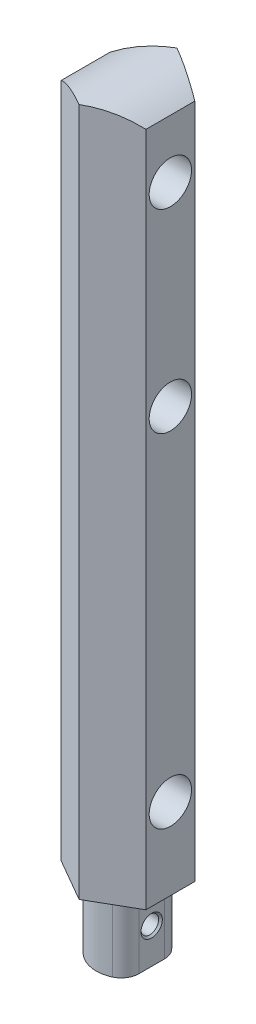
ISO-10303-21;
HEADER;
FILE_DESCRIPTION(('STEP AP214'),'2;1');
FILE_NAME('part.step','',(''),(''),'','','');
FILE_SCHEMA(('AUTOMOTIVE_DESIGN { 1 0 10303 214 1 1 1 1 }'));
ENDSEC;
DATA;
#1=APPLICATION_CONTEXT('core data for automotive mechanical design processes');
#2=APPLICATION_PROTOCOL_DEFINITION('international standard','automotive_design',2000,#1);
#3=PRODUCT_CONTEXT('',#1,'mechanical');
#4=PRODUCT('Part','Part','',(#3));
#5=PRODUCT_RELATED_PRODUCT_CATEGORY('part','',(#4));
#6=PRODUCT_DEFINITION_FORMATION('','',#4);
#7=PRODUCT_DEFINITION_CONTEXT('part definition',#1,'design');
#8=PRODUCT_DEFINITION('design','',#6,#7);
#9=PRODUCT_DEFINITION_SHAPE('','',#8);
#10=(LENGTH_UNIT() NAMED_UNIT(*) SI_UNIT(.MILLI.,.METRE.));
#11=(NAMED_UNIT(*) PLANE_ANGLE_UNIT() SI_UNIT($,.RADIAN.));
#12=(NAMED_UNIT(*) SI_UNIT($,.STERADIAN.) SOLID_ANGLE_UNIT());
#13=UNCERTAINTY_MEASURE_WITH_UNIT(LENGTH_MEASURE(1.E-05),#10,'distance_accuracy_value','');
#14=(GEOMETRIC_REPRESENTATION_CONTEXT(3) GLOBAL_UNCERTAINTY_ASSIGNED_CONTEXT((#13)) GLOBAL_UNIT_ASSIGNED_CONTEXT((#10,
#11,#12)) REPRESENTATION_CONTEXT('',''));
#15=CARTESIAN_POINT('',(0.,0.,0.));
#16=DIRECTION('',(0.,0.,1.));
#17=DIRECTION('',(1.,0.,0.));
#18=AXIS2_PLACEMENT_3D('',#15,#16,#17);
#19=CARTESIAN_POINT('',(11.9999999999999,-195.,-6.92820323027564));
#20=DIRECTION('',(0.499999999999995,0.,-0.866025403784441));
#21=DIRECTION('',(-0.866025403784441,0.,-0.499999999999995));
#22=AXIS2_PLACEMENT_3D('',#19,#20,#21);
#23=PLANE('',#22);
#24=CARTESIAN_POINT('',(0.,-22.,-13.856406460551));
#25=DIRECTION('',(0.499999999999995,0.,-0.866025403784441));
#26=DIRECTION('',(-0.866025403784441,0.,-0.499999999999995));
#27=AXIS2_PLACEMENT_3D('',#24,#25,#26);
#28=ELLIPSE('',#27,25.4034118443434,22.);
#29=CARTESIAN_POINT('',(11.9999999999999,-3.56091108541416,-6.92820323027564));
#30=VERTEX_POINT('',#29);
#31=CARTESIAN_POINT('',(0.,0.,-13.856406460551));
#32=VERTEX_POINT('',#31);
#33=EDGE_CURVE('E173',#30,#32,#28,.F.);
#34=ORIENTED_EDGE('',*,*,#33,.F.);
#35=DIRECTION('',(0.,1.,0.));
#36=VECTOR('',#35,1.);
#37=CARTESIAN_POINT('',(11.9999999999999,-195.,-6.92820323027564));
#38=LINE('',#37,#36);
#39=CARTESIAN_POINT('',(11.9999999999999,-195.,-6.92820323027564));
#40=VERTEX_POINT('',#39);
#41=EDGE_CURVE('E11',#40,#30,#38,.T.);
#42=ORIENTED_EDGE('',*,*,#41,.F.);
#43=DIRECTION('',(-0.866025403784441,0.,-0.499999999999995));
#44=VECTOR('',#43,1.);
#45=CARTESIAN_POINT('',(11.9999999999999,-195.,-6.92820323027564));
#46=LINE('',#45,#44);
#47=CARTESIAN_POINT('',(0.,-195.,-13.856406460551));
#48=VERTEX_POINT('',#47);
#49=EDGE_CURVE('E203',#40,#48,#46,.T.);
#50=ORIENTED_EDGE('',*,*,#49,.T.);
#51=DIRECTION('',(0.,1.,0.));
#52=VECTOR('',#51,1.);
#53=CARTESIAN_POINT('',(0.,-195.,-13.856406460551));
#54=LINE('',#53,#52);
#55=EDGE_CURVE('E145',#48,#32,#54,.T.);
#56=ORIENTED_EDGE('',*,*,#55,.T.);
#57=EDGE_LOOP('',(#34,#42,#50,#56));
#58=FACE_BOUND('',#57,.T.);
#59=ADVANCED_FACE('F37',(#58),#23,.T.);
#60=CARTESIAN_POINT('',(12.,-195.,6.92820323027539));
#61=DIRECTION('',(1.,0.,0.));
#62=DIRECTION('',(0.,0.,-1.));
#63=AXIS2_PLACEMENT_3D('',#60,#61,#62);
#64=PLANE('',#63);
#65=CARTESIAN_POINT('',(12.,-75.,-1.26194426293921E-13));
#66=DIRECTION('',(1.,0.,0.));
#67=DIRECTION('',(0.,0.,-1.));
#68=AXIS2_PLACEMENT_3D('',#65,#66,#67);
#69=CIRCLE('',#68,6.00000000000001);
#70=CARTESIAN_POINT('',(11.9999999999999,-75.,-6.00000000000013));
#71=VERTEX_POINT('',#70);
#72=EDGE_CURVE('E497',#71,#71,#69,.T.);
#73=ORIENTED_EDGE('',*,*,#72,.F.);
#74=EDGE_LOOP('',(#73));
#75=FACE_BOUND('',#74,.T.);
#76=CARTESIAN_POINT('',(12.,-20.,-1.26194426293921E-13));
#77=DIRECTION('',(1.,0.,0.));
#78=DIRECTION('',(0.,0.,-1.));
#79=AXIS2_PLACEMENT_3D('',#76,#77,#78);
#80=CIRCLE('',#79,6.00000000000001);
#81=CARTESIAN_POINT('',(11.9999999999999,-20.,-6.00000000000014));
#82=VERTEX_POINT('',#81);
#83=EDGE_CURVE('E485',#82,#82,#80,.T.);
#84=ORIENTED_EDGE('',*,*,#83,.F.);
#85=EDGE_LOOP('',(#84));
#86=FACE_BOUND('',#85,.T.);
#87=CARTESIAN_POINT('',(12.,-172.,-1.26194426293921E-13));
#88=DIRECTION('',(1.,0.,0.));
#89=DIRECTION('',(0.,0.,-1.));
#90=AXIS2_PLACEMENT_3D('',#87,#88,#89);
#91=CIRCLE('',#90,6.00000000000001);
#92=CARTESIAN_POINT('',(11.9999999999999,-172.,-6.00000000000013));
#93=VERTEX_POINT('',#92);
#94=EDGE_CURVE('E473',#93,#93,#91,.T.);
#95=ORIENTED_EDGE('',*,*,#94,.F.);
#96=EDGE_LOOP('',(#95));
#97=FACE_BOUND('',#96,.T.);
#98=ORIENTED_EDGE('',*,*,#41,.T.);
#99=DIRECTION('',(0.,0.,-1.));
#100=VECTOR('',#99,1.);
#101=CARTESIAN_POINT('',(11.9999999999999,-3.56091108541416,20.));
#102=LINE('',#101,#100);
#103=CARTESIAN_POINT('',(11.9999999999999,-3.56091108541416,6.92820323027547));
#104=VERTEX_POINT('',#103);
#105=EDGE_CURVE('E127',#104,#30,#102,.T.);
#106=ORIENTED_EDGE('',*,*,#105,.F.);
#107=DIRECTION('',(0.,1.,0.));
#108=VECTOR('',#107,1.);
#109=CARTESIAN_POINT('',(12.,-195.,6.92820323027539));
#110=LINE('',#109,#108);
#111=CARTESIAN_POINT('',(12.,-195.,6.92820323027539));
#112=VERTEX_POINT('',#111);
#113=EDGE_CURVE('E50',#112,#104,#110,.T.);
#114=ORIENTED_EDGE('',*,*,#113,.F.);
#115=DIRECTION('',(0.,0.,-1.));
#116=VECTOR('',#115,1.);
#117=CARTESIAN_POINT('',(12.,-195.,6.92820323027539));
#118=LINE('',#117,#116);
#119=EDGE_CURVE('E149',#112,#40,#118,.T.);
#120=ORIENTED_EDGE('',*,*,#119,.T.);
#121=EDGE_LOOP('',(#98,#106,#114,#120));
#122=FACE_BOUND('',#121,.T.);
#123=ADVANCED_FACE('F167',(#75,#86,#97,#122),#64,.T.);
#124=CARTESIAN_POINT('',(0.,-195.,13.856406460551));
#125=DIRECTION('',(0.500000000000007,0.,0.866025403784434));
#126=DIRECTION('',(0.866025403784435,0.,-0.500000000000007));
#127=AXIS2_PLACEMENT_3D('',#124,#125,#126);
#128=PLANE('',#127);
#129=CARTESIAN_POINT('',(0.,-22.,13.8564064605511));
#130=DIRECTION('',(0.500000000000007,0.,0.866025403784434));
#131=DIRECTION('',(0.866025403784435,0.,-0.500000000000007));
#132=AXIS2_PLACEMENT_3D('',#129,#130,#131);
#133=ELLIPSE('',#132,25.4034118443437,22.);
#134=CARTESIAN_POINT('',(0.,0.,13.8564064605511));
#135=VERTEX_POINT('',#134);
#136=EDGE_CURVE('E136',#135,#104,#133,.F.);
#137=ORIENTED_EDGE('',*,*,#136,.F.);
#138=DIRECTION('',(0.,1.,0.));
#139=VECTOR('',#138,1.);
#140=CARTESIAN_POINT('',(0.,-195.,13.856406460551));
#141=LINE('',#140,#139);
#142=CARTESIAN_POINT('',(0.,-195.,13.856406460551));
#143=VERTEX_POINT('',#142);
#144=EDGE_CURVE('E135',#143,#135,#141,.T.);
#145=ORIENTED_EDGE('',*,*,#144,.F.);
#146=DIRECTION('',(0.866025403784434,0.,-0.500000000000007));
#147=VECTOR('',#146,1.);
#148=CARTESIAN_POINT('',(0.,-195.,13.856406460551));
#149=LINE('',#148,#147);
#150=EDGE_CURVE('E154',#143,#112,#149,.T.);
#151=ORIENTED_EDGE('',*,*,#150,.T.);
#152=ORIENTED_EDGE('',*,*,#113,.T.);
#153=EDGE_LOOP('',(#137,#145,#151,#152));
#154=FACE_BOUND('',#153,.T.);
#155=ADVANCED_FACE('F164',(#154),#128,.T.);
#156=CARTESIAN_POINT('',(-12.,-195.,6.92820323027556));
#157=DIRECTION('',(-0.499999999999995,0.,0.866025403784441));
#158=DIRECTION('',(0.866025403784442,0.,0.499999999999995));
#159=AXIS2_PLACEMENT_3D('',#156,#157,#158);
#160=PLANE('',#159);
#161=CARTESIAN_POINT('',(0.,-22.,13.8564064605509));
#162=DIRECTION('',(-0.499999999999995,0.,0.866025403784441));
#163=DIRECTION('',(-0.866025403784442,0.,-0.499999999999995));
#164=AXIS2_PLACEMENT_3D('',#161,#162,#163);
#165=ELLIPSE('',#164,25.4034118443434,22.);
#166=CARTESIAN_POINT('',(-12.,-3.56091108541423,6.92820323027556));
#167=VERTEX_POINT('',#166);
#168=EDGE_CURVE('E120',#167,#135,#165,.F.);
#169=ORIENTED_EDGE('',*,*,#168,.F.);
#170=DIRECTION('',(0.,1.,0.));
#171=VECTOR('',#170,1.);
#172=CARTESIAN_POINT('',(-12.,-195.,6.92820323027556));
#173=LINE('',#172,#171);
#174=CARTESIAN_POINT('',(-12.,-195.,6.92820323027556));
#175=VERTEX_POINT('',#174);
#176=EDGE_CURVE('E133',#175,#167,#173,.T.);
#177=ORIENTED_EDGE('',*,*,#176,.F.);
#178=DIRECTION('',(0.866025403784442,0.,0.499999999999995));
#179=VECTOR('',#178,1.);
#180=CARTESIAN_POINT('',(-12.,-195.,6.92820323027556));
#181=LINE('',#180,#179);
#182=EDGE_CURVE('E159',#175,#143,#181,.T.);
#183=ORIENTED_EDGE('',*,*,#182,.T.);
#184=ORIENTED_EDGE('',*,*,#144,.T.);
#185=EDGE_LOOP('',(#169,#177,#183,#184));
#186=FACE_BOUND('',#185,.T.);
#187=ADVANCED_FACE('F131',(#186),#160,.T.);
#188=CARTESIAN_POINT('',(-12.,-195.,-6.92820323027547));
#189=DIRECTION('',(-1.,0.,0.));
#190=DIRECTION('',(0.,0.,1.));
#191=AXIS2_PLACEMENT_3D('',#188,#189,#190);
#192=PLANE('',#191);
#193=CARTESIAN_POINT('',(-12.0000000000002,-75.,1.26194426293923E-13));
#194=DIRECTION('',(1.,0.,0.));
#195=DIRECTION('',(0.,0.,-1.));
#196=AXIS2_PLACEMENT_3D('',#193,#194,#195);
#197=CIRCLE('',#196,3.25);
#198=CARTESIAN_POINT('',(-12.0000000000002,-75.,-3.24999999999988));
#199=VERTEX_POINT('',#198);
#200=EDGE_CURVE('E488',#199,#199,#197,.T.);
#201=ORIENTED_EDGE('',*,*,#200,.T.);
#202=EDGE_LOOP('',(#201));
#203=FACE_BOUND('',#202,.T.);
#204=CARTESIAN_POINT('',(-12.0000000000002,-20.,1.26194426293923E-13));
#205=DIRECTION('',(1.,0.,0.));
#206=DIRECTION('',(0.,0.,-1.));
#207=AXIS2_PLACEMENT_3D('',#204,#205,#206);
#208=CIRCLE('',#207,3.25000000000001);
#209=CARTESIAN_POINT('',(-12.0000000000002,-20.,-3.24999999999988));
#210=VERTEX_POINT('',#209);
#211=EDGE_CURVE('E476',#210,#210,#208,.T.);
#212=ORIENTED_EDGE('',*,*,#211,.T.);
#213=EDGE_LOOP('',(#212));
#214=FACE_BOUND('',#213,.T.);
#215=CARTESIAN_POINT('',(-12.0000000000001,-172.,1.26194426293923E-13));
#216=DIRECTION('',(1.,0.,0.));
#217=DIRECTION('',(0.,0.,-1.));
#218=AXIS2_PLACEMENT_3D('',#215,#216,#217);
#219=CIRCLE('',#218,3.25);
#220=CARTESIAN_POINT('',(-12.0000000000002,-172.,-3.24999999999988));
#221=VERTEX_POINT('',#220);
#222=EDGE_CURVE('E461',#221,#221,#219,.T.);
#223=ORIENTED_EDGE('',*,*,#222,.T.);
#224=EDGE_LOOP('',(#223));
#225=FACE_BOUND('',#224,.T.);
#226=ORIENTED_EDGE('',*,*,#176,.T.);
#227=DIRECTION('',(0.,0.,-1.));
#228=VECTOR('',#227,1.);
#229=CARTESIAN_POINT('',(-12.,-3.56091108541423,20.));
#230=LINE('',#229,#228);
#231=CARTESIAN_POINT('',(-12.,-3.56091108541423,-6.92820323027548));
#232=VERTEX_POINT('',#231);
#233=EDGE_CURVE('E117',#167,#232,#230,.T.);
#234=ORIENTED_EDGE('',*,*,#233,.T.);
#235=DIRECTION('',(0.,1.,0.));
#236=VECTOR('',#235,1.);
#237=CARTESIAN_POINT('',(-12.,-195.,-6.92820323027547));
#238=LINE('',#237,#236);
#239=CARTESIAN_POINT('',(-12.,-195.,-6.92820323027547));
#240=VERTEX_POINT('',#239);
#241=EDGE_CURVE('E142',#240,#232,#238,.T.);
#242=ORIENTED_EDGE('',*,*,#241,.F.);
#243=DIRECTION('',(0.,0.,1.));
#244=VECTOR('',#243,1.);
#245=CARTESIAN_POINT('',(-12.,-195.,-6.92820323027547));
#246=LINE('',#245,#244);
#247=EDGE_CURVE('E141',#240,#175,#246,.T.);
#248=ORIENTED_EDGE('',*,*,#247,.T.);
#249=EDGE_LOOP('',(#226,#234,#242,#248));
#250=FACE_BOUND('',#249,.T.);
#251=ADVANCED_FACE('F139',(#203,#214,#225,#250),#192,.T.);
#252=CARTESIAN_POINT('',(0.,-195.,-13.856406460551));
#253=DIRECTION('',(-0.500000000000001,0.,-0.866025403784438));
#254=DIRECTION('',(-0.866025403784438,0.,0.500000000000001));
#255=AXIS2_PLACEMENT_3D('',#252,#253,#254);
#256=PLANE('',#255);
#257=CARTESIAN_POINT('',(0.,-22.,-13.856406460551));
#258=DIRECTION('',(-0.500000000000001,0.,-0.866025403784438));
#259=DIRECTION('',(0.866025403784438,0.,-0.500000000000001));
#260=AXIS2_PLACEMENT_3D('',#257,#258,#259);
#261=ELLIPSE('',#260,25.4034118443436,22.);
#262=EDGE_CURVE('E123',#32,#232,#261,.F.);
#263=ORIENTED_EDGE('',*,*,#262,.F.);
#264=ORIENTED_EDGE('',*,*,#55,.F.);
#265=DIRECTION('',(-0.866025403784438,0.,0.500000000000001));
#266=VECTOR('',#265,1.);
#267=CARTESIAN_POINT('',(0.,-195.,-13.856406460551));
#268=LINE('',#267,#266);
#269=EDGE_CURVE('E205',#48,#240,#268,.T.);
#270=ORIENTED_EDGE('',*,*,#269,.T.);
#271=ORIENTED_EDGE('',*,*,#241,.T.);
#272=EDGE_LOOP('',(#263,#264,#270,#271));
#273=FACE_BOUND('',#272,.T.);
#274=ADVANCED_FACE('F213',(#273),#256,.T.);
#275=CARTESIAN_POINT('',(0.,-195.,0.));
#276=DIRECTION('',(0.,1.,0.));
#277=DIRECTION('',(0.,0.,1.));
#278=AXIS2_PLACEMENT_3D('',#275,#276,#277);
#279=PLANE('',#278);
#280=ORIENTED_EDGE('',*,*,#49,.F.);
#281=ORIENTED_EDGE('',*,*,#119,.F.);
#282=ORIENTED_EDGE('',*,*,#150,.F.);
#283=ORIENTED_EDGE('',*,*,#182,.F.);
#284=ORIENTED_EDGE('',*,*,#247,.F.);
#285=ORIENTED_EDGE('',*,*,#269,.F.);
#286=EDGE_LOOP('',(#280,#281,#282,#283,#284,#285));
#287=FACE_BOUND('',#286,.T.);
#288=CARTESIAN_POINT('',(1.7,-195.,-3.62077339804633));
#289=DIRECTION('',(0.,-1.,0.));
#290=DIRECTION('',(0.,0.,-1.));
#291=AXIS2_PLACEMENT_3D('',#288,#289,#290);
#292=CIRCLE('',#291,5.);
#293=CARTESIAN_POINT('',(3.825,-195.,-8.14674014560426));
#294=VERTEX_POINT('',#293);
#295=CARTESIAN_POINT('',(6.7,-195.,-3.62077339804633));
#296=VERTEX_POINT('',#295);
#297=EDGE_CURVE('E58',#294,#296,#292,.T.);
#298=ORIENTED_EDGE('',*,*,#297,.F.);
#299=CARTESIAN_POINT('',(0.,-195.,0.));
#300=DIRECTION('',(0.,-1.,0.));
#301=DIRECTION('',(0.,0.,-1.));
#302=AXIS2_PLACEMENT_3D('',#299,#300,#301);
#303=CIRCLE('',#302,9.);
#304=CARTESIAN_POINT('',(3.825,-195.,8.14674014560426));
#305=VERTEX_POINT('',#304);
#306=EDGE_CURVE('E62',#305,#294,#303,.T.);
#307=ORIENTED_EDGE('',*,*,#306,.F.);
#308=CARTESIAN_POINT('',(1.7,-195.,3.62077339804633));
#309=DIRECTION('',(0.,-1.,0.));
#310=DIRECTION('',(0.,0.,-1.));
#311=AXIS2_PLACEMENT_3D('',#308,#309,#310);
#312=CIRCLE('',#311,5.);
#313=CARTESIAN_POINT('',(6.7,-195.,3.62077339804633));
#314=VERTEX_POINT('',#313);
#315=EDGE_CURVE('E189',#314,#305,#312,.T.);
#316=ORIENTED_EDGE('',*,*,#315,.F.);
#317=DIRECTION('',(0.,0.,1.));
#318=VECTOR('',#317,1.);
#319=CARTESIAN_POINT('',(6.7,-195.,3.62077339804633));
#320=LINE('',#319,#318);
#321=EDGE_CURVE('E186',#296,#314,#320,.T.);
#322=ORIENTED_EDGE('',*,*,#321,.F.);
#323=EDGE_LOOP('',(#298,#307,#316,#322));
#324=FACE_BOUND('',#323,.T.);
#325=ADVANCED_FACE('F210',(#287,#324),#279,.F.);
#326=CARTESIAN_POINT('',(1.7,-215.,-3.62077339804633));
#327=DIRECTION('',(0.,1.,0.));
#328=DIRECTION('',(0.,0.,1.));
#329=AXIS2_PLACEMENT_3D('',#326,#327,#328);
#330=CYLINDRICAL_SURFACE('',#329,5.);
#331=ORIENTED_EDGE('',*,*,#297,.T.);
#332=DIRECTION('',(0.,1.,0.));
#333=VECTOR('',#332,1.);
#334=CARTESIAN_POINT('',(6.7,-215.,-3.62077339804633));
#335=LINE('',#334,#333);
#336=CARTESIAN_POINT('',(6.7,-215.,-3.62077339804633));
#337=VERTEX_POINT('',#336);
#338=EDGE_CURVE('E200',#337,#296,#335,.T.);
#339=ORIENTED_EDGE('',*,*,#338,.F.);
#340=CARTESIAN_POINT('',(1.7,-215.,-3.62077339804633));
#341=DIRECTION('',(0.,-1.,0.));
#342=DIRECTION('',(0.,0.,-1.));
#343=AXIS2_PLACEMENT_3D('',#340,#341,#342);
#344=CIRCLE('',#343,5.);
#345=CARTESIAN_POINT('',(3.825,-215.,-8.14674014560426));
#346=VERTEX_POINT('',#345);
#347=EDGE_CURVE('E175',#346,#337,#344,.T.);
#348=ORIENTED_EDGE('',*,*,#347,.F.);
#349=DIRECTION('',(0.,1.,0.));
#350=VECTOR('',#349,1.);
#351=CARTESIAN_POINT('',(3.825,-215.,-8.14674014560426));
#352=LINE('',#351,#350);
#353=EDGE_CURVE('E184',#346,#294,#352,.T.);
#354=ORIENTED_EDGE('',*,*,#353,.T.);
#355=EDGE_LOOP('',(#331,#339,#348,#354));
#356=FACE_BOUND('',#355,.T.);
#357=ADVANCED_FACE('F219',(#356),#330,.T.);
#358=CARTESIAN_POINT('',(6.7,-215.,3.62077339804633));
#359=DIRECTION('',(-1.,0.,0.));
#360=DIRECTION('',(0.,0.,1.));
#361=AXIS2_PLACEMENT_3D('',#358,#359,#360);
#362=PLANE('',#361);
#363=CARTESIAN_POINT('',(6.7,-205.,0.));
#364=DIRECTION('',(1.,0.,0.));
#365=DIRECTION('',(0.,0.,-1.));
#366=AXIS2_PLACEMENT_3D('',#363,#364,#365);
#367=CIRCLE('',#366,3.025);
#368=CARTESIAN_POINT('',(6.7,-205.,-3.025));
#369=VERTEX_POINT('',#368);
#370=EDGE_CURVE('E458',#369,#369,#367,.T.);
#371=ORIENTED_EDGE('',*,*,#370,.F.);
#372=EDGE_LOOP('',(#371));
#373=FACE_BOUND('',#372,.T.);
#374=ORIENTED_EDGE('',*,*,#321,.T.);
#375=DIRECTION('',(0.,1.,0.));
#376=VECTOR('',#375,1.);
#377=CARTESIAN_POINT('',(6.7,-215.,3.62077339804633));
#378=LINE('',#377,#376);
#379=CARTESIAN_POINT('',(6.7,-215.,3.62077339804633));
#380=VERTEX_POINT('',#379);
#381=EDGE_CURVE('E197',#380,#314,#378,.T.);
#382=ORIENTED_EDGE('',*,*,#381,.F.);
#383=DIRECTION('',(0.,0.,1.));
#384=VECTOR('',#383,1.);
#385=CARTESIAN_POINT('',(6.7,-215.,3.62077339804633));
#386=LINE('',#385,#384);
#387=EDGE_CURVE('E178',#337,#380,#386,.T.);
#388=ORIENTED_EDGE('',*,*,#387,.F.);
#389=ORIENTED_EDGE('',*,*,#338,.T.);
#390=EDGE_LOOP('',(#374,#382,#388,#389));
#391=FACE_BOUND('',#390,.T.);
#392=ADVANCED_FACE('F351',(#373,#391),#362,.F.);
#393=CARTESIAN_POINT('',(1.7,-215.,3.62077339804633));
#394=DIRECTION('',(0.,1.,0.));
#395=DIRECTION('',(0.,0.,1.));
#396=AXIS2_PLACEMENT_3D('',#393,#394,#395);
#397=CYLINDRICAL_SURFACE('',#396,5.);
#398=ORIENTED_EDGE('',*,*,#315,.T.);
#399=DIRECTION('',(0.,1.,0.));
#400=VECTOR('',#399,1.);
#401=CARTESIAN_POINT('',(3.825,-215.,8.14674014560426));
#402=LINE('',#401,#400);
#403=CARTESIAN_POINT('',(3.825,-215.,8.14674014560426));
#404=VERTEX_POINT('',#403);
#405=EDGE_CURVE('E194',#404,#305,#402,.T.);
#406=ORIENTED_EDGE('',*,*,#405,.F.);
#407=CARTESIAN_POINT('',(1.7,-215.,3.62077339804633));
#408=DIRECTION('',(0.,-1.,0.));
#409=DIRECTION('',(0.,0.,-1.));
#410=AXIS2_PLACEMENT_3D('',#407,#408,#409);
#411=CIRCLE('',#410,5.);
#412=EDGE_CURVE('E180',#380,#404,#411,.T.);
#413=ORIENTED_EDGE('',*,*,#412,.F.);
#414=ORIENTED_EDGE('',*,*,#381,.T.);
#415=EDGE_LOOP('',(#398,#406,#413,#414));
#416=FACE_BOUND('',#415,.T.);
#417=ADVANCED_FACE('F347',(#416),#397,.T.);
#418=CARTESIAN_POINT('',(0.,-215.,0.));
#419=DIRECTION('',(0.,1.,0.));
#420=DIRECTION('',(0.,0.,1.));
#421=AXIS2_PLACEMENT_3D('',#418,#419,#420);
#422=CYLINDRICAL_SURFACE('',#421,9.);
#423=CARTESIAN_POINT('',(-8.64580823289529,-205.,-2.5));
#424=CARTESIAN_POINT('',(-8.64581037496086,-204.86251304671,-2.49999714996618));
#425=CARTESIAN_POINT('',(-8.6491236093716,-204.724996759927,-2.48861977425244));
#426=CARTESIAN_POINT('',(-8.66197474072459,-204.453951404569,-2.44350693717148));
#427=CARTESIAN_POINT('',(-8.67151541786232,-204.320424144722,-2.40976148964065));
#428=CARTESIAN_POINT('',(-8.69565935423008,-204.061317673241,-2.32112008680785));
#429=CARTESIAN_POINT('',(-8.71025507855494,-203.935726959246,-2.26625559744293));
#430=CARTESIAN_POINT('',(-8.74285475062134,-203.695509077945,-2.13703377417484));
#431=CARTESIAN_POINT('',(-8.76085904445198,-203.580883025715,-2.06267446056935));
#432=CARTESIAN_POINT('',(-8.79879482245346,-203.362738144417,-1.89441531907552));
#433=CARTESIAN_POINT('',(-8.81876275539879,-203.259560882364,-1.80008077870935));
#434=CARTESIAN_POINT('',(-8.85806239814547,-203.070269160961,-1.59548286960026));
#435=CARTESIAN_POINT('',(-8.87739403696071,-202.984156600035,-1.48521773095721));
#436=CARTESIAN_POINT('',(-8.91365202741974,-202.829995538839,-1.24950042890599));
#437=CARTESIAN_POINT('',(-8.93053038427289,-202.762289408156,-1.12381632761082));
#438=CARTESIAN_POINT('',(-8.95956018312964,-202.64910072624,-0.862300362049412));
#439=CARTESIAN_POINT('',(-8.97171249276935,-202.603614095426,-0.726470365890882));
#440=CARTESIAN_POINT('',(-8.98966318340414,-202.537269054527,-0.452086360205852));
#441=CARTESIAN_POINT('',(-8.99561138050703,-202.515828957739,-0.313682975067005));
#442=CARTESIAN_POINT('',(-9.00100867384282,-202.496352543344,-0.0351244568787163));
#443=CARTESIAN_POINT('',(-9.00045894674934,-202.498311988443,0.105030354422788));
#444=CARTESIAN_POINT('',(-8.99303086374216,-202.525175552384,0.379054247152555));
#445=CARTESIAN_POINT('',(-8.98632598075261,-202.549450763969,0.512990410045108));
#446=CARTESIAN_POINT('',(-8.96754760099034,-202.619237138233,0.774807483322489));
#447=CARTESIAN_POINT('',(-8.95547378574645,-202.664749560655,0.902688034006096));
#448=CARTESIAN_POINT('',(-8.9270625060623,-202.776182080583,1.15033359179949));
#449=CARTESIAN_POINT('',(-8.91068150784286,-202.842311909524,1.2699990265879));
#450=CARTESIAN_POINT('',(-8.87541221350138,-202.99293961582,1.49674457308828));
#451=CARTESIAN_POINT('',(-8.85652339359456,-203.077441332692,1.60382204684014));
#452=CARTESIAN_POINT('',(-8.81753663226074,-203.265728657777,1.80610676038231));
#453=CARTESIAN_POINT('',(-8.79741936953618,-203.370061805646,1.90080125058982));
#454=CARTESIAN_POINT('',(-8.75880383152746,-203.593332675122,2.07148108085115));
#455=CARTESIAN_POINT('',(-8.74030567318147,-203.712271450118,2.14746507027559));
#456=CARTESIAN_POINT('',(-8.70694013940655,-203.962564721412,2.27900238121954));
#457=CARTESIAN_POINT('',(-8.69209980055975,-204.094002269306,2.3344050164098));
#458=CARTESIAN_POINT('',(-8.66806022503139,-204.364843595759,2.42215297643584));
#459=CARTESIAN_POINT('',(-8.65885945119346,-204.50424519225,2.45450458459977));
#460=CARTESIAN_POINT('',(-8.64747148287153,-204.782234513998,2.49432455486229));
#461=CARTESIAN_POINT('',(-8.64506746157861,-204.920703234809,2.50256249342185));
#462=CARTESIAN_POINT('',(-8.64694988564765,-205.197041990452,2.49605092061448));
#463=CARTESIAN_POINT('',(-8.65123554925282,-205.33491209335,2.48130409524808));
#464=CARTESIAN_POINT('',(-8.66580389953325,-205.603097746691,2.42992241428478));
#465=CARTESIAN_POINT('',(-8.67595686836151,-205.733511668847,2.39376059864355));
#466=CARTESIAN_POINT('',(-8.70098664146817,-205.986420227101,2.30111259188307));
#467=CARTESIAN_POINT('',(-8.7158641004892,-206.10891376272,2.24462358357886));
#468=CARTESIAN_POINT('',(-8.74910362417903,-206.345695368558,2.11139571215837));
#469=CARTESIAN_POINT('',(-8.76753959855501,-206.459721771038,2.03421067264883));
#470=CARTESIAN_POINT('',(-8.80564999409988,-206.673486244076,1.86232721847474));
#471=CARTESIAN_POINT('',(-8.825324668038,-206.773221384664,1.76762522160664));
#472=CARTESIAN_POINT('',(-8.86445019939347,-206.958821470568,1.5598174364672));
#473=CARTESIAN_POINT('',(-8.88387421295946,-207.044146810068,1.44622359870982));
#474=CARTESIAN_POINT('',(-8.91967402878593,-207.194523971078,1.20588311286949));
#475=CARTESIAN_POINT('',(-8.93604999253947,-207.259576866794,1.07913716217183));
#476=CARTESIAN_POINT('',(-8.96380327787493,-207.366949591823,0.816978395233254));
#477=CARTESIAN_POINT('',(-8.97521823979383,-207.409441166067,0.681640101050663));
#478=CARTESIAN_POINT('',(-8.99192942838897,-207.470968173441,0.40537631289535));
#479=CARTESIAN_POINT('',(-8.99722713582854,-207.490009283144,0.264452179596259));
#480=CARTESIAN_POINT('',(-9.00103042209333,-207.503714329686,-0.0139601523576523));
#481=CARTESIAN_POINT('',(-8.99975568986337,-207.499166707091,-0.151407064589653));
#482=CARTESIAN_POINT('',(-8.99106088846503,-207.467671437509,-0.423500619727721));
#483=CARTESIAN_POINT('',(-8.98364108593446,-207.44072476243,-0.558147383873815));
#484=CARTESIAN_POINT('',(-8.96353984091205,-207.365656776372,-0.819784983469313));
#485=CARTESIAN_POINT('',(-8.95090116936266,-207.317707402067,-0.94682865628115));
#486=CARTESIAN_POINT('',(-8.92167820297651,-207.202148061769,-1.19113920788315));
#487=CARTESIAN_POINT('',(-8.90509332036378,-207.134535166621,-1.30840462671539));
#488=CARTESIAN_POINT('',(-8.86915397347007,-206.979328057284,-1.5334511217291));
#489=CARTESIAN_POINT('',(-8.84973411731035,-206.891219913931,-1.64086726646984));
#490=CARTESIAN_POINT('',(-8.8105592080908,-206.698482069548,-1.83965563573725));
#491=CARTESIAN_POINT('',(-8.79080406570366,-206.593847901953,-1.931023508681));
#492=CARTESIAN_POINT('',(-8.75263553519991,-206.367955482556,-2.09734241907802));
#493=CARTESIAN_POINT('',(-8.73426670491594,-206.246353610468,-2.17183796747972));
#494=CARTESIAN_POINT('',(-8.70160385709125,-205.991856012821,-2.29922652645138));
#495=CARTESIAN_POINT('',(-8.68730739437859,-205.85896712682,-2.35213250833712));
#496=CARTESIAN_POINT('',(-8.66621345779749,-205.605639870262,-2.42859494882475));
#497=CARTESIAN_POINT('',(-8.65862660680177,-205.486210594444,-2.45530563406019));
#498=CARTESIAN_POINT('',(-8.64842338463344,-205.244528351776,-2.49100820491655));
#499=CARTESIAN_POINT('',(-8.64580632782194,-205.122275776788,-2.50000253471396));
#500=CARTESIAN_POINT('',(-8.64580823289529,-205.,-2.5));
#501=B_SPLINE_CURVE_WITH_KNOTS('',3,(#423,#424,#425,#426,#427,#428,#429,#430,#431,#432,#433,
#434,#435,#436,#437,#438,#439,#440,#441,#442,#443,#444,#445,#446,#447,#448,#449,#450,#451,#452,
#453,#454,#455,#456,#457,#458,#459,#460,#461,#462,#463,#464,#465,#466,#467,#468,#469,#470,#471,
#472,#473,#474,#475,#476,#477,#478,#479,#480,#481,#482,#483,#484,#485,#486,#487,#488,#489,#490,
#491,#492,#493,#494,#495,#496,#497,#498,#499,#500),.UNSPECIFIED.,.T.,.F.,(4,2,2,2,2,2,2,2,2,2,2,
2,2,2,2,2,2,2,2,2,2,2,2,2,2,2,2,2,2,2,2,2,2,2,2,2,2,2,4),(0.,0.412010791688976,
0.824205648454525,1.23578872527859,1.64741361462618,2.06913895760032,2.49091119062408,
2.92006196750632,3.34913392107924,3.76758631224742,4.18596292931723,4.59289867518083,
4.99985856264057,5.41110133303433,5.82243013129569,6.24742875551487,6.67245804954203,
7.10054057407688,7.52850636571893,7.94265637768505,8.35675799569094,8.76203677700909,
9.16737174834452,9.58226667645633,9.99724654423656,10.4253750626708,10.8534808913584,
11.2782793253857,11.7029749096958,12.1135686473819,12.5241445701257,12.9314203987338,
13.3387569278366,13.7576868945778,14.1767302818544,14.6060087946726,15.0350290098245,
15.4015066296817,15.7679336861631),.UNSPECIFIED.);
#502=CARTESIAN_POINT('',(-8.64580823289529,-205.,-2.5));
#503=VERTEX_POINT('',#502);
#504=EDGE_CURVE('E40',#503,#503,#501,.T.);
#505=ORIENTED_EDGE('',*,*,#504,.T.);
#506=EDGE_LOOP('',(#505));
#507=FACE_BOUND('',#506,.T.);
#508=ORIENTED_EDGE('',*,*,#306,.T.);
#509=ORIENTED_EDGE('',*,*,#353,.F.);
#510=CARTESIAN_POINT('',(0.,-215.,0.));
#511=DIRECTION('',(0.,-1.,0.));
#512=DIRECTION('',(0.,0.,-1.));
#513=AXIS2_PLACEMENT_3D('',#510,#511,#512);
#514=CIRCLE('',#513,9.);
#515=EDGE_CURVE('E182',#404,#346,#514,.T.);
#516=ORIENTED_EDGE('',*,*,#515,.F.);
#517=ORIENTED_EDGE('',*,*,#405,.T.);
#518=EDGE_LOOP('',(#508,#509,#516,#517));
#519=FACE_BOUND('',#518,.T.);
#520=ADVANCED_FACE('F342',(#507,#519),#422,.T.);
#521=CARTESIAN_POINT('',(1.7,-215.,-3.62077339804633));
#522=DIRECTION('',(0.,-1.,0.));
#523=DIRECTION('',(0.,0.,-1.));
#524=AXIS2_PLACEMENT_3D('',#521,#522,#523);
#525=PLANE('',#524);
#526=ORIENTED_EDGE('',*,*,#347,.T.);
#527=ORIENTED_EDGE('',*,*,#387,.T.);
#528=ORIENTED_EDGE('',*,*,#412,.T.);
#529=ORIENTED_EDGE('',*,*,#515,.T.);
#530=EDGE_LOOP('',(#526,#527,#528,#529));
#531=FACE_BOUND('',#530,.T.);
#532=ADVANCED_FACE('F340',(#531),#525,.T.);
#533=CARTESIAN_POINT('',(0.,-22.,20.));
#534=DIRECTION('',(0.,0.,-1.));
#535=DIRECTION('',(-1.,0.,0.));
#536=AXIS2_PLACEMENT_3D('',#533,#534,#535);
#537=CYLINDRICAL_SURFACE('',#536,22.);
#538=ORIENTED_EDGE('',*,*,#33,.T.);
#539=ORIENTED_EDGE('',*,*,#262,.T.);
#540=ORIENTED_EDGE('',*,*,#233,.F.);
#541=ORIENTED_EDGE('',*,*,#168,.T.);
#542=ORIENTED_EDGE('',*,*,#136,.T.);
#543=ORIENTED_EDGE('',*,*,#105,.T.);
#544=EDGE_LOOP('',(#538,#539,#540,#541,#542,#543));
#545=FACE_BOUND('',#544,.T.);
#546=ADVANCED_FACE('F119',(#545),#537,.T.);
#547=CARTESIAN_POINT('',(6.7,-205.,0.));
#548=DIRECTION('',(1.,0.,0.));
#549=DIRECTION('',(0.,0.,-1.));
#550=AXIS2_PLACEMENT_3D('',#547,#548,#549);
#551=CYLINDRICAL_SURFACE('',#550,2.5);
#552=CARTESIAN_POINT('',(6.17499999999998,-205.,0.));
#553=DIRECTION('',(1.,0.,0.));
#554=DIRECTION('',(0.,0.,-1.));
#555=AXIS2_PLACEMENT_3D('',#552,#553,#554);
#556=CIRCLE('',#555,2.5);
#557=CARTESIAN_POINT('',(6.17499999999998,-205.,-2.5));
#558=VERTEX_POINT('',#557);
#559=EDGE_CURVE('E460',#558,#558,#556,.T.);
#560=ORIENTED_EDGE('',*,*,#559,.T.);
#561=EDGE_LOOP('',(#560));
#562=FACE_BOUND('',#561,.T.);
#563=ORIENTED_EDGE('',*,*,#504,.F.);
#564=EDGE_LOOP('',(#563));
#565=FACE_BOUND('',#564,.T.);
#566=ADVANCED_FACE('F332',(#562,#565),#551,.F.);
#567=CARTESIAN_POINT('',(6.7,-205.,0.));
#568=DIRECTION('',(1.,0.,0.));
#569=DIRECTION('',(0.,0.,-1.));
#570=AXIS2_PLACEMENT_3D('',#567,#568,#569);
#571=CONICAL_SURFACE('',#570,3.025,0.785398163397427);
#572=ORIENTED_EDGE('',*,*,#559,.F.);
#573=EDGE_LOOP('',(#572));
#574=FACE_BOUND('',#573,.T.);
#575=ORIENTED_EDGE('',*,*,#370,.T.);
#576=EDGE_LOOP('',(#575));
#577=FACE_BOUND('',#576,.T.);
#578=ADVANCED_FACE('F329',(#574,#577),#571,.F.);
#579=CARTESIAN_POINT('',(12.,-172.,-1.26194426293921E-13));
#580=DIRECTION('',(1.,0.,0.));
#581=DIRECTION('',(0.,0.,-1.));
#582=AXIS2_PLACEMENT_3D('',#579,#580,#581);
#583=CYLINDRICAL_SURFACE('',#582,3.25);
#584=ORIENTED_EDGE('',*,*,#222,.F.);
#585=EDGE_LOOP('',(#584));
#586=FACE_BOUND('',#585,.T.);
#587=CARTESIAN_POINT('',(-3.00000000000002,-172.,0.));
#588=DIRECTION('',(1.,0.,0.));
#589=DIRECTION('',(0.,0.,-1.));
#590=AXIS2_PLACEMENT_3D('',#587,#588,#589);
#591=CIRCLE('',#590,3.25);
#592=CARTESIAN_POINT('',(-3.00000000000006,-172.,-3.24999999999997));
#593=VERTEX_POINT('',#592);
#594=EDGE_CURVE('E465',#593,#593,#591,.T.);
#595=ORIENTED_EDGE('',*,*,#594,.T.);
#596=EDGE_LOOP('',(#595));
#597=FACE_BOUND('',#596,.T.);
#598=ADVANCED_FACE('F325',(#586,#597),#583,.F.);
#599=CARTESIAN_POINT('',(-3.00000000000002,-168.75,0.));
#600=DIRECTION('',(-1.,0.,0.));
#601=DIRECTION('',(0.,0.,1.));
#602=AXIS2_PLACEMENT_3D('',#599,#600,#601);
#603=PLANE('',#602);
#604=ORIENTED_EDGE('',*,*,#594,.F.);
#605=EDGE_LOOP('',(#604));
#606=FACE_BOUND('',#605,.T.);
#607=CARTESIAN_POINT('',(-3.00000000000002,-172.,0.));
#608=DIRECTION('',(1.,0.,0.));
#609=DIRECTION('',(0.,0.,-1.));
#610=AXIS2_PLACEMENT_3D('',#607,#608,#609);
#611=CIRCLE('',#610,6.00000000000001);
#612=CARTESIAN_POINT('',(-3.00000000000009,-172.,-5.99999999999997));
#613=VERTEX_POINT('',#612);
#614=EDGE_CURVE('E470',#613,#613,#611,.T.);
#615=ORIENTED_EDGE('',*,*,#614,.T.);
#616=EDGE_LOOP('',(#615));
#617=FACE_BOUND('',#616,.T.);
#618=ADVANCED_FACE('F321',(#606,#617),#603,.F.);
#619=CARTESIAN_POINT('',(12.,-172.,-1.26194426293921E-13));
#620=DIRECTION('',(1.,0.,0.));
#621=DIRECTION('',(0.,0.,-1.));
#622=AXIS2_PLACEMENT_3D('',#619,#620,#621);
#623=CYLINDRICAL_SURFACE('',#622,6.00000000000001);
#624=ORIENTED_EDGE('',*,*,#614,.F.);
#625=EDGE_LOOP('',(#624));
#626=FACE_BOUND('',#625,.T.);
#627=ORIENTED_EDGE('',*,*,#94,.T.);
#628=EDGE_LOOP('',(#627));
#629=FACE_BOUND('',#628,.T.);
#630=ADVANCED_FACE('F261',(#626,#629),#623,.F.);
#631=CARTESIAN_POINT('',(12.,-20.,-1.26194426293921E-13));
#632=DIRECTION('',(1.,0.,0.));
#633=DIRECTION('',(0.,0.,-1.));
#634=AXIS2_PLACEMENT_3D('',#631,#632,#633);
#635=CYLINDRICAL_SURFACE('',#634,3.25000000000001);
#636=ORIENTED_EDGE('',*,*,#211,.F.);
#637=EDGE_LOOP('',(#636));
#638=FACE_BOUND('',#637,.T.);
#639=CARTESIAN_POINT('',(0.,-20.,0.));
#640=DIRECTION('',(1.,0.,0.));
#641=DIRECTION('',(0.,0.,-1.));
#642=AXIS2_PLACEMENT_3D('',#639,#640,#641);
#643=CIRCLE('',#642,3.25000000000001);
#644=CARTESIAN_POINT('',(0.,-20.,-3.25000000000001));
#645=VERTEX_POINT('',#644);
#646=EDGE_CURVE('E479',#645,#645,#643,.T.);
#647=ORIENTED_EDGE('',*,*,#646,.T.);
#648=EDGE_LOOP('',(#647));
#649=FACE_BOUND('',#648,.T.);
#650=ADVANCED_FACE('F255',(#638,#649),#635,.F.);
#651=CARTESIAN_POINT('',(0.,-16.75,0.));
#652=DIRECTION('',(-1.,0.,0.));
#653=DIRECTION('',(0.,0.,1.));
#654=AXIS2_PLACEMENT_3D('',#651,#652,#653);
#655=PLANE('',#654);
#656=ORIENTED_EDGE('',*,*,#646,.F.);
#657=EDGE_LOOP('',(#656));
#658=FACE_BOUND('',#657,.T.);
#659=CARTESIAN_POINT('',(0.,-20.,0.));
#660=DIRECTION('',(1.,0.,0.));
#661=DIRECTION('',(0.,0.,-1.));
#662=AXIS2_PLACEMENT_3D('',#659,#660,#661);
#663=CIRCLE('',#662,6.00000000000001);
#664=CARTESIAN_POINT('',(0.,-20.,-6.00000000000001));
#665=VERTEX_POINT('',#664);
#666=EDGE_CURVE('E482',#665,#665,#663,.T.);
#667=ORIENTED_EDGE('',*,*,#666,.T.);
#668=EDGE_LOOP('',(#667));
#669=FACE_BOUND('',#668,.T.);
#670=ADVANCED_FACE('F260',(#658,#669),#655,.F.);
#671=CARTESIAN_POINT('',(12.,-20.,-1.26194426293921E-13));
#672=DIRECTION('',(1.,0.,0.));
#673=DIRECTION('',(0.,0.,-1.));
#674=AXIS2_PLACEMENT_3D('',#671,#672,#673);
#675=CYLINDRICAL_SURFACE('',#674,6.00000000000001);
#676=ORIENTED_EDGE('',*,*,#666,.F.);
#677=EDGE_LOOP('',(#676));
#678=FACE_BOUND('',#677,.T.);
#679=ORIENTED_EDGE('',*,*,#83,.T.);
#680=EDGE_LOOP('',(#679));
#681=FACE_BOUND('',#680,.T.);
#682=ADVANCED_FACE('F273',(#678,#681),#675,.F.);
#683=CARTESIAN_POINT('',(12.,-75.,-1.26194426293921E-13));
#684=DIRECTION('',(1.,0.,0.));
#685=DIRECTION('',(0.,0.,-1.));
#686=AXIS2_PLACEMENT_3D('',#683,#684,#685);
#687=CYLINDRICAL_SURFACE('',#686,3.25000000000001);
#688=ORIENTED_EDGE('',*,*,#200,.F.);
#689=EDGE_LOOP('',(#688));
#690=FACE_BOUND('',#689,.T.);
#691=CARTESIAN_POINT('',(0.,-75.,0.));
#692=DIRECTION('',(1.,0.,0.));
#693=DIRECTION('',(0.,0.,-1.));
#694=AXIS2_PLACEMENT_3D('',#691,#692,#693);
#695=CIRCLE('',#694,3.25000000000002);
#696=CARTESIAN_POINT('',(0.,-75.,-3.25000000000002));
#697=VERTEX_POINT('',#696);
#698=EDGE_CURVE('E491',#697,#697,#695,.T.);
#699=ORIENTED_EDGE('',*,*,#698,.T.);
#700=EDGE_LOOP('',(#699));
#701=FACE_BOUND('',#700,.T.);
#702=ADVANCED_FACE('F283',(#690,#701),#687,.F.);
#703=CARTESIAN_POINT('',(0.,-71.75,0.));
#704=DIRECTION('',(-1.,0.,0.));
#705=DIRECTION('',(0.,0.,1.));
#706=AXIS2_PLACEMENT_3D('',#703,#704,#705);
#707=PLANE('',#706);
#708=ORIENTED_EDGE('',*,*,#698,.F.);
#709=EDGE_LOOP('',(#708));
#710=FACE_BOUND('',#709,.T.);
#711=CARTESIAN_POINT('',(0.,-75.,0.));
#712=DIRECTION('',(1.,0.,0.));
#713=DIRECTION('',(0.,0.,-1.));
#714=AXIS2_PLACEMENT_3D('',#711,#712,#713);
#715=CIRCLE('',#714,6.00000000000001);
#716=CARTESIAN_POINT('',(0.,-75.,-6.00000000000001));
#717=VERTEX_POINT('',#716);
#718=EDGE_CURVE('E494',#717,#717,#715,.T.);
#719=ORIENTED_EDGE('',*,*,#718,.T.);
#720=EDGE_LOOP('',(#719));
#721=FACE_BOUND('',#720,.T.);
#722=ADVANCED_FACE('F293',(#710,#721),#707,.F.);
#723=CARTESIAN_POINT('',(12.,-75.,-1.26194426293921E-13));
#724=DIRECTION('',(1.,0.,0.));
#725=DIRECTION('',(0.,0.,-1.));
#726=AXIS2_PLACEMENT_3D('',#723,#724,#725);
#727=CYLINDRICAL_SURFACE('',#726,6.00000000000001);
#728=ORIENTED_EDGE('',*,*,#718,.F.);
#729=EDGE_LOOP('',(#728));
#730=FACE_BOUND('',#729,.T.);
#731=ORIENTED_EDGE('',*,*,#72,.T.);
#732=EDGE_LOOP('',(#731));
#733=FACE_BOUND('',#732,.T.);
#734=ADVANCED_FACE('F303',(#730,#733),#727,.F.);
#735=CLOSED_SHELL('',(#59,#123,#155,#187,#251,#274,#325,#357,#392,#417,#520,#532,#546,#566,#578,
#598,#618,#630,#650,#670,#682,#702,#722,#734));
#736=MANIFOLD_SOLID_BREP('B2',#735);
#737=ADVANCED_BREP_SHAPE_REPRESENTATION('',(#18,#736),#14);
#738=SHAPE_DEFINITION_REPRESENTATION(#9,#737);
ENDSEC;
END-ISO-10303-21;
